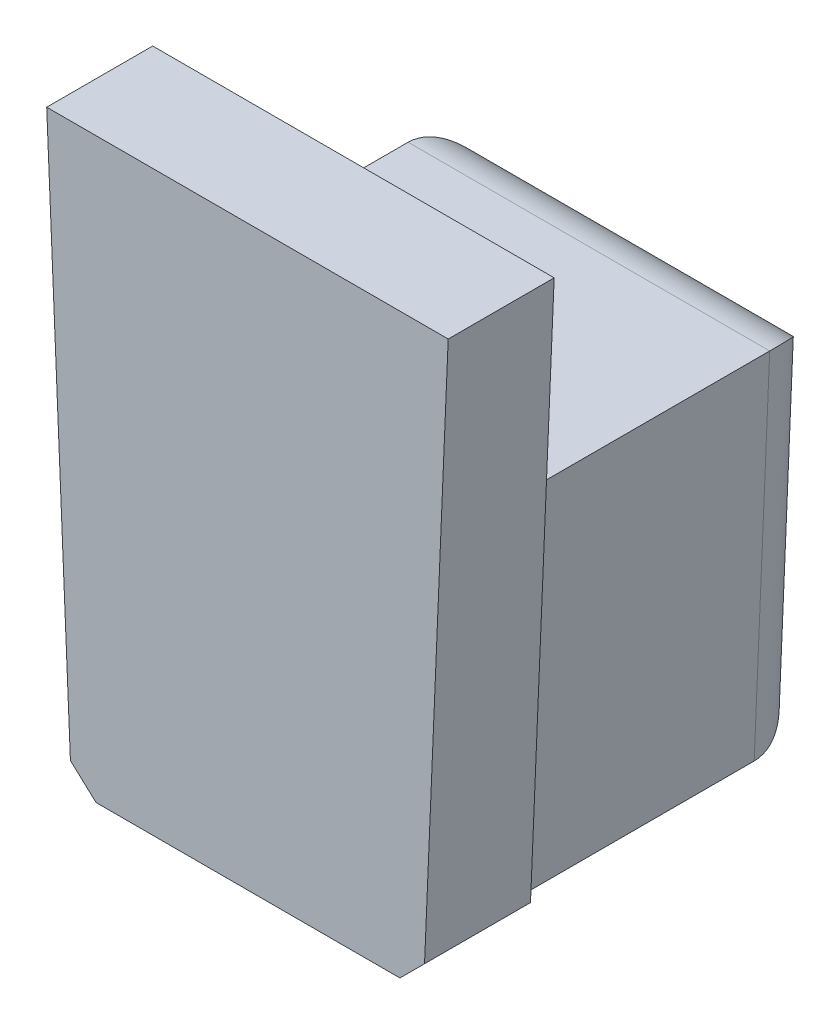
ISO-10303-21;
HEADER;
FILE_DESCRIPTION(('STEP AP214'),'2;1');
FILE_NAME('part.step','',(''),(''),'','','');
FILE_SCHEMA(('AUTOMOTIVE_DESIGN { 1 0 10303 214 1 1 1 1 }'));
ENDSEC;
DATA;
#1=APPLICATION_CONTEXT('core data for automotive mechanical design processes');
#2=APPLICATION_PROTOCOL_DEFINITION('international standard','automotive_design',2000,#1);
#3=PRODUCT_CONTEXT('',#1,'mechanical');
#4=PRODUCT('Part','Part','',(#3));
#5=PRODUCT_RELATED_PRODUCT_CATEGORY('part','',(#4));
#6=PRODUCT_DEFINITION_FORMATION('','',#4);
#7=PRODUCT_DEFINITION_CONTEXT('part definition',#1,'design');
#8=PRODUCT_DEFINITION('design','',#6,#7);
#9=PRODUCT_DEFINITION_SHAPE('','',#8);
#10=(LENGTH_UNIT() NAMED_UNIT(*) SI_UNIT(.MILLI.,.METRE.));
#11=(NAMED_UNIT(*) PLANE_ANGLE_UNIT() SI_UNIT($,.RADIAN.));
#12=(NAMED_UNIT(*) SI_UNIT($,.STERADIAN.) SOLID_ANGLE_UNIT());
#13=UNCERTAINTY_MEASURE_WITH_UNIT(LENGTH_MEASURE(1.E-05),#10,'distance_accuracy_value','');
#14=(GEOMETRIC_REPRESENTATION_CONTEXT(3) GLOBAL_UNCERTAINTY_ASSIGNED_CONTEXT((#13)) GLOBAL_UNIT_ASSIGNED_CONTEXT((#10,
#11,#12)) REPRESENTATION_CONTEXT('',''));
#15=CARTESIAN_POINT('',(0.,0.,0.));
#16=DIRECTION('',(0.,0.,1.));
#17=DIRECTION('',(1.,0.,0.));
#18=AXIS2_PLACEMENT_3D('',#15,#16,#17);
#19=CARTESIAN_POINT('',(0.,0.,0.));
#20=DIRECTION('',(0.,0.,-1.));
#21=DIRECTION('',(-1.,0.,0.));
#22=AXIS2_PLACEMENT_3D('',#19,#20,#21);
#23=PLANE('',#22);
#24=DIRECTION('',(0.0427742711573851,0.999084762033209,0.));
#25=VECTOR('',#24,1.);
#26=CARTESIAN_POINT('',(68.2,0.,0.));
#27=LINE('',#26,#25);
#28=CARTESIAN_POINT('',(64.1789137380191,-93.9210862619809,0.));
#29=VERTEX_POINT('',#28);
#30=CARTESIAN_POINT('',(68.2,0.,0.));
#31=VERTEX_POINT('',#30);
#32=EDGE_CURVE('E167',#29,#31,#27,.T.);
#33=ORIENTED_EDGE('',*,*,#32,.F.);
#34=DIRECTION('',(0.70710678118655,0.707106781186545,0.));
#35=VECTOR('',#34,1.);
#36=CARTESIAN_POINT('',(79.0499999999997,-79.0500000000004,0.));
#37=LINE('',#36,#35);
#38=CARTESIAN_POINT('',(60.,-98.1,0.));
#39=VERTEX_POINT('',#38);
#40=EDGE_CURVE('E180',#29,#39,#37,.F.);
#41=ORIENTED_EDGE('',*,*,#40,.T.);
#42=DIRECTION('',(1.,0.,0.));
#43=VECTOR('',#42,1.);
#44=CARTESIAN_POINT('',(64.,-98.1,0.));
#45=LINE('',#44,#43);
#46=CARTESIAN_POINT('',(8.38274194225,-98.1,0.));
#47=VERTEX_POINT('',#46);
#48=EDGE_CURVE('E164',#47,#39,#45,.T.);
#49=ORIENTED_EDGE('',*,*,#48,.F.);
#50=DIRECTION('',(0.736705587409529,-0.676213633018133,0.));
#51=VECTOR('',#50,1.);
#52=CARTESIAN_POINT('',(-45.0373790182484,-49.0662819336187,0.));
#53=LINE('',#52,#51);
#54=CARTESIAN_POINT('',(4.02890291537046,-94.1036609518671,0.));
#55=VERTEX_POINT('',#54);
#56=EDGE_CURVE('E178',#47,#55,#53,.F.);
#57=ORIENTED_EDGE('',*,*,#56,.T.);
#58=DIRECTION('',(0.0427742711573851,-0.999084762033209,0.));
#59=VECTOR('',#58,1.);
#60=CARTESIAN_POINT('',(4.2,-98.1,0.));
#61=LINE('',#60,#59);
#62=CARTESIAN_POINT('',(0.,0.,0.));
#63=VERTEX_POINT('',#62);
#64=EDGE_CURVE('E127',#63,#55,#61,.T.);
#65=ORIENTED_EDGE('',*,*,#64,.F.);
#66=DIRECTION('',(-1.,0.,0.));
#67=VECTOR('',#66,1.);
#68=CARTESIAN_POINT('',(0.,0.,0.));
#69=LINE('',#68,#67);
#70=EDGE_CURVE('E154',#31,#63,#69,.T.);
#71=ORIENTED_EDGE('',*,*,#70,.F.);
#72=EDGE_LOOP('',(#33,#41,#49,#57,#65,#71));
#73=FACE_BOUND('',#72,.T.);
#74=DIRECTION('',(-1.,0.,0.));
#75=VECTOR('',#74,1.);
#76=CARTESIAN_POINT('',(62.1694216698406,-94.1,0.));
#77=LINE('',#76,#75);
#78=CARTESIAN_POINT('',(62.1694216698406,-94.1,0.));
#79=VERTEX_POINT('',#78);
#80=CARTESIAN_POINT('',(6.0305783301594,-94.1,0.));
#81=VERTEX_POINT('',#80);
#82=EDGE_CURVE('E123',#79,#81,#77,.T.);
#83=ORIENTED_EDGE('',*,*,#82,.F.);
#84=DIRECTION('',(-0.0427742711573849,-0.999084762033209,0.));
#85=VECTOR('',#84,1.);
#86=CARTESIAN_POINT('',(64.8086098923266,-32.4561036605051,0.));
#87=LINE('',#86,#85);
#88=CARTESIAN_POINT('',(64.8086098923266,-32.4561036605051,0.));
#89=VERTEX_POINT('',#88);
#90=EDGE_CURVE('E131',#89,#79,#87,.T.);
#91=ORIENTED_EDGE('',*,*,#90,.F.);
#92=DIRECTION('',(1.,0.,0.));
#93=VECTOR('',#92,1.);
#94=CARTESIAN_POINT('',(3.39139010767338,-32.4561036605051,0.));
#95=LINE('',#94,#93);
#96=CARTESIAN_POINT('',(3.39139010767338,-32.4561036605051,0.));
#97=VERTEX_POINT('',#96);
#98=EDGE_CURVE('E142',#97,#89,#95,.T.);
#99=ORIENTED_EDGE('',*,*,#98,.F.);
#100=DIRECTION('',(-0.0427742711573851,0.999084762033209,0.));
#101=VECTOR('',#100,1.);
#102=CARTESIAN_POINT('',(6.0305783301594,-94.1,0.));
#103=LINE('',#102,#101);
#104=EDGE_CURVE('E140',#81,#97,#103,.T.);
#105=ORIENTED_EDGE('',*,*,#104,.F.);
#106=EDGE_LOOP('',(#83,#91,#99,#105));
#107=FACE_BOUND('',#106,.T.);
#108=ADVANCED_FACE('F32',(#73,#107),#23,.T.);
#109=CARTESIAN_POINT('',(4.2,-98.1,18.));
#110=DIRECTION('',(0.999084762033209,0.0427742711573851,0.));
#111=DIRECTION('',(-0.0427742711573851,0.99908476203321,0.));
#112=AXIS2_PLACEMENT_3D('',#109,#110,#111);
#113=PLANE('',#112);
#114=ORIENTED_EDGE('',*,*,#64,.T.);
#115=DIRECTION('',(0.,0.,1.));
#116=VECTOR('',#115,1.);
#117=CARTESIAN_POINT('',(4.02890291537046,-94.1036609518671,18.));
#118=LINE('',#117,#116);
#119=CARTESIAN_POINT('',(4.02890291537046,-94.1036609518671,18.));
#120=VERTEX_POINT('',#119);
#121=EDGE_CURVE('E191',#55,#120,#118,.T.);
#122=ORIENTED_EDGE('',*,*,#121,.T.);
#123=DIRECTION('',(0.0427742711573851,-0.999084762033209,0.));
#124=VECTOR('',#123,1.);
#125=CARTESIAN_POINT('',(4.2,-98.1,18.));
#126=LINE('',#125,#124);
#127=CARTESIAN_POINT('',(0.,0.,18.));
#128=VERTEX_POINT('',#127);
#129=EDGE_CURVE('E150',#128,#120,#126,.T.);
#130=ORIENTED_EDGE('',*,*,#129,.F.);
#131=DIRECTION('',(0.,0.,-1.));
#132=VECTOR('',#131,1.);
#133=CARTESIAN_POINT('',(0.,0.,18.));
#134=LINE('',#133,#132);
#135=EDGE_CURVE('E161',#128,#63,#134,.T.);
#136=ORIENTED_EDGE('',*,*,#135,.T.);
#137=EDGE_LOOP('',(#114,#122,#130,#136));
#138=FACE_BOUND('',#137,.T.);
#139=ADVANCED_FACE('F247',(#138),#113,.F.);
#140=CARTESIAN_POINT('',(64.,-98.1,18.));
#141=DIRECTION('',(0.,1.,0.));
#142=DIRECTION('',(0.,0.,1.));
#143=AXIS2_PLACEMENT_3D('',#140,#141,#142);
#144=PLANE('',#143);
#145=ORIENTED_EDGE('',*,*,#48,.T.);
#146=DIRECTION('',(0.,0.,1.));
#147=VECTOR('',#146,1.);
#148=CARTESIAN_POINT('',(60.,-98.1,18.));
#149=LINE('',#148,#147);
#150=CARTESIAN_POINT('',(60.,-98.1,18.));
#151=VERTEX_POINT('',#150);
#152=EDGE_CURVE('E185',#39,#151,#149,.T.);
#153=ORIENTED_EDGE('',*,*,#152,.T.);
#154=DIRECTION('',(1.,0.,0.));
#155=VECTOR('',#154,1.);
#156=CARTESIAN_POINT('',(64.,-98.1,18.));
#157=LINE('',#156,#155);
#158=CARTESIAN_POINT('',(8.38274194225002,-98.1,18.));
#159=VERTEX_POINT('',#158);
#160=EDGE_CURVE('E153',#159,#151,#157,.T.);
#161=ORIENTED_EDGE('',*,*,#160,.F.);
#162=DIRECTION('',(0.,0.,-1.));
#163=VECTOR('',#162,1.);
#164=CARTESIAN_POINT('',(8.38274194225001,-98.1,18.));
#165=LINE('',#164,#163);
#166=EDGE_CURVE('E182',#159,#47,#165,.T.);
#167=ORIENTED_EDGE('',*,*,#166,.T.);
#168=EDGE_LOOP('',(#145,#153,#161,#167));
#169=FACE_BOUND('',#168,.T.);
#170=ADVANCED_FACE('F253',(#169),#144,.F.);
#171=CARTESIAN_POINT('',(68.2,0.,18.));
#172=DIRECTION('',(-0.999084762033209,0.0427742711573851,0.));
#173=DIRECTION('',(-0.0427742711573851,-0.99908476203321,0.));
#174=AXIS2_PLACEMENT_3D('',#171,#172,#173);
#175=PLANE('',#174);
#176=DIRECTION('',(0.0427742711573851,0.999084762033209,0.));
#177=VECTOR('',#176,1.);
#178=CARTESIAN_POINT('',(68.2,0.,18.));
#179=LINE('',#178,#177);
#180=CARTESIAN_POINT('',(64.1789137380192,-93.9210862619808,18.));
#181=VERTEX_POINT('',#180);
#182=CARTESIAN_POINT('',(68.2,0.,18.));
#183=VERTEX_POINT('',#182);
#184=EDGE_CURVE('E157',#181,#183,#179,.T.);
#185=ORIENTED_EDGE('',*,*,#184,.F.);
#186=DIRECTION('',(0.,0.,-1.));
#187=VECTOR('',#186,1.);
#188=CARTESIAN_POINT('',(64.1789137380192,-93.9210862619808,18.));
#189=LINE('',#188,#187);
#190=EDGE_CURVE('E175',#181,#29,#189,.T.);
#191=ORIENTED_EDGE('',*,*,#190,.T.);
#192=ORIENTED_EDGE('',*,*,#32,.T.);
#193=DIRECTION('',(0.,0.,-1.));
#194=VECTOR('',#193,1.);
#195=CARTESIAN_POINT('',(68.2,0.,18.));
#196=LINE('',#195,#194);
#197=EDGE_CURVE('E172',#183,#31,#196,.T.);
#198=ORIENTED_EDGE('',*,*,#197,.F.);
#199=EDGE_LOOP('',(#185,#191,#192,#198));
#200=FACE_BOUND('',#199,.T.);
#201=ADVANCED_FACE('F264',(#200),#175,.F.);
#202=CARTESIAN_POINT('',(0.,0.,18.));
#203=DIRECTION('',(0.,-1.,0.));
#204=DIRECTION('',(0.,0.,-1.));
#205=AXIS2_PLACEMENT_3D('',#202,#203,#204);
#206=PLANE('',#205);
#207=ORIENTED_EDGE('',*,*,#70,.T.);
#208=ORIENTED_EDGE('',*,*,#135,.F.);
#209=DIRECTION('',(-1.,0.,0.));
#210=VECTOR('',#209,1.);
#211=CARTESIAN_POINT('',(0.,0.,18.));
#212=LINE('',#211,#210);
#213=EDGE_CURVE('E159',#183,#128,#212,.T.);
#214=ORIENTED_EDGE('',*,*,#213,.F.);
#215=ORIENTED_EDGE('',*,*,#197,.T.);
#216=EDGE_LOOP('',(#207,#208,#214,#215));
#217=FACE_BOUND('',#216,.T.);
#218=ADVANCED_FACE('F261',(#217),#206,.F.);
#219=CARTESIAN_POINT('',(0.,0.,18.));
#220=DIRECTION('',(0.,0.,-1.));
#221=DIRECTION('',(-1.,0.,0.));
#222=AXIS2_PLACEMENT_3D('',#219,#220,#221);
#223=PLANE('',#222);
#224=ORIENTED_EDGE('',*,*,#160,.T.);
#225=DIRECTION('',(-0.70710678118655,-0.707106781186545,0.));
#226=VECTOR('',#225,1.);
#227=CARTESIAN_POINT('',(64.1789137380192,-93.9210862619808,18.));
#228=LINE('',#227,#226);
#229=EDGE_CURVE('E189',#151,#181,#228,.F.);
#230=ORIENTED_EDGE('',*,*,#229,.T.);
#231=ORIENTED_EDGE('',*,*,#184,.T.);
#232=ORIENTED_EDGE('',*,*,#213,.T.);
#233=ORIENTED_EDGE('',*,*,#129,.T.);
#234=DIRECTION('',(-0.736705587409529,0.676213633018133,0.));
#235=VECTOR('',#234,1.);
#236=CARTESIAN_POINT('',(8.38274194225001,-98.1,18.));
#237=LINE('',#236,#235);
#238=EDGE_CURVE('E187',#120,#159,#237,.F.);
#239=ORIENTED_EDGE('',*,*,#238,.T.);
#240=EDGE_LOOP('',(#224,#230,#231,#232,#233,#239));
#241=FACE_BOUND('',#240,.T.);
#242=ADVANCED_FACE('F259',(#241),#223,.F.);
#243=CARTESIAN_POINT('',(64.8086098923266,-32.4561036605051,-50.));
#244=DIRECTION('',(-0.999084762033209,0.0427742711573849,0.));
#245=DIRECTION('',(-0.0427742711573849,-0.999084762033209,0.));
#246=AXIS2_PLACEMENT_3D('',#243,#244,#245);
#247=PLANE('',#246);
#248=DIRECTION('',(0.,0.,1.));
#249=VECTOR('',#248,1.);
#250=CARTESIAN_POINT('',(62.1694216698406,-94.1,-50.));
#251=LINE('',#250,#249);
#252=CARTESIAN_POINT('',(62.1694216698406,-94.1,-40.));
#253=VERTEX_POINT('',#252);
#254=EDGE_CURVE('E119',#253,#79,#251,.T.);
#255=ORIENTED_EDGE('',*,*,#254,.F.);
#256=DIRECTION('',(-0.0427742711573849,-0.999084762033209,0.));
#257=VECTOR('',#256,1.);
#258=CARTESIAN_POINT('',(64.8086098923266,-32.4561036605051,-40.));
#259=LINE('',#258,#257);
#260=CARTESIAN_POINT('',(64.8086098923266,-32.4561036605051,-40.));
#261=VERTEX_POINT('',#260);
#262=EDGE_CURVE('E205',#253,#261,#259,.F.);
#263=ORIENTED_EDGE('',*,*,#262,.T.);
#264=DIRECTION('',(0.,0.,1.));
#265=VECTOR('',#264,1.);
#266=CARTESIAN_POINT('',(64.8086098923266,-32.4561036605051,-50.));
#267=LINE('',#266,#265);
#268=EDGE_CURVE('E134',#261,#89,#267,.T.);
#269=ORIENTED_EDGE('',*,*,#268,.T.);
#270=ORIENTED_EDGE('',*,*,#90,.T.);
#271=EDGE_LOOP('',(#255,#263,#269,#270));
#272=FACE_BOUND('',#271,.T.);
#273=ADVANCED_FACE('F132',(#272),#247,.F.);
#274=CARTESIAN_POINT('',(62.1694216698406,-94.1,-50.));
#275=DIRECTION('',(0.,1.,0.));
#276=DIRECTION('',(-1.,0.,0.));
#277=AXIS2_PLACEMENT_3D('',#274,#275,#276);
#278=PLANE('',#277);
#279=DIRECTION('',(0.,0.,1.));
#280=VECTOR('',#279,1.);
#281=CARTESIAN_POINT('',(6.0305783301594,-94.1,-50.));
#282=LINE('',#281,#280);
#283=CARTESIAN_POINT('',(6.0305783301594,-94.1,-40.));
#284=VERTEX_POINT('',#283);
#285=EDGE_CURVE('E128',#284,#81,#282,.T.);
#286=ORIENTED_EDGE('',*,*,#285,.F.);
#287=DIRECTION('',(-1.,0.,0.));
#288=VECTOR('',#287,1.);
#289=CARTESIAN_POINT('',(62.1694216698406,-94.1,-40.));
#290=LINE('',#289,#288);
#291=EDGE_CURVE('E11',#284,#253,#290,.F.);
#292=ORIENTED_EDGE('',*,*,#291,.T.);
#293=ORIENTED_EDGE('',*,*,#254,.T.);
#294=ORIENTED_EDGE('',*,*,#82,.T.);
#295=EDGE_LOOP('',(#286,#292,#293,#294));
#296=FACE_BOUND('',#295,.T.);
#297=ADVANCED_FACE('F121',(#296),#278,.F.);
#298=CARTESIAN_POINT('',(6.0305783301594,-94.1,-50.));
#299=DIRECTION('',(0.999084762033209,0.0427742711573851,0.));
#300=DIRECTION('',(-0.0427742711573851,0.999084762033209,0.));
#301=AXIS2_PLACEMENT_3D('',#298,#299,#300);
#302=PLANE('',#301);
#303=DIRECTION('',(0.,0.,1.));
#304=VECTOR('',#303,1.);
#305=CARTESIAN_POINT('',(3.39139010767338,-32.4561036605051,-50.));
#306=LINE('',#305,#304);
#307=CARTESIAN_POINT('',(3.39139010767338,-32.4561036605051,-40.));
#308=VERTEX_POINT('',#307);
#309=EDGE_CURVE('E147',#308,#97,#306,.T.);
#310=ORIENTED_EDGE('',*,*,#309,.F.);
#311=DIRECTION('',(-0.0427742711573851,0.999084762033209,0.));
#312=VECTOR('',#311,1.);
#313=CARTESIAN_POINT('',(6.0305783301594,-94.1,-40.));
#314=LINE('',#313,#312);
#315=EDGE_CURVE('E41',#308,#284,#314,.F.);
#316=ORIENTED_EDGE('',*,*,#315,.T.);
#317=ORIENTED_EDGE('',*,*,#285,.T.);
#318=ORIENTED_EDGE('',*,*,#104,.T.);
#319=EDGE_LOOP('',(#310,#316,#317,#318));
#320=FACE_BOUND('',#319,.T.);
#321=ADVANCED_FACE('F244',(#320),#302,.F.);
#322=CARTESIAN_POINT('',(3.39139010767338,-32.4561036605051,-50.));
#323=DIRECTION('',(0.,-1.,0.));
#324=DIRECTION('',(1.,0.,0.));
#325=AXIS2_PLACEMENT_3D('',#322,#323,#324);
#326=PLANE('',#325);
#327=ORIENTED_EDGE('',*,*,#268,.F.);
#328=DIRECTION('',(1.,0.,0.));
#329=VECTOR('',#328,1.);
#330=CARTESIAN_POINT('',(3.39139010767338,-32.4561036605051,-40.));
#331=LINE('',#330,#329);
#332=EDGE_CURVE('E202',#261,#308,#331,.F.);
#333=ORIENTED_EDGE('',*,*,#332,.T.);
#334=ORIENTED_EDGE('',*,*,#309,.T.);
#335=ORIENTED_EDGE('',*,*,#98,.T.);
#336=EDGE_LOOP('',(#327,#333,#334,#335));
#337=FACE_BOUND('',#336,.T.);
#338=ADVANCED_FACE('F228',(#337),#326,.F.);
#339=CARTESIAN_POINT('',(0.,0.,-50.));
#340=DIRECTION('',(0.,0.,-1.));
#341=DIRECTION('',(-1.,0.,0.));
#342=AXIS2_PLACEMENT_3D('',#339,#340,#341);
#343=PLANE('',#342);
#344=DIRECTION('',(-0.0427742711573851,0.999084762033209,0.));
#345=VECTOR('',#344,1.);
#346=CARTESIAN_POINT('',(13.3822377280055,-32.0283609489312,-50.));
#347=LINE('',#346,#345);
#348=CARTESIAN_POINT('',(15.6116045375314,-84.1,-50.));
#349=VERTEX_POINT('',#348);
#350=CARTESIAN_POINT('',(13.8286854281952,-42.4561036605051,-50.));
#351=VERTEX_POINT('',#350);
#352=EDGE_CURVE('E195',#349,#351,#347,.T.);
#353=ORIENTED_EDGE('',*,*,#352,.T.);
#354=DIRECTION('',(1.,0.,0.));
#355=VECTOR('',#354,1.);
#356=CARTESIAN_POINT('',(64.8086098923266,-42.4561036605051,-50.));
#357=LINE('',#356,#355);
#358=CARTESIAN_POINT('',(54.3713145718048,-42.4561036605051,-50.));
#359=VERTEX_POINT('',#358);
#360=EDGE_CURVE('E199',#351,#359,#357,.T.);
#361=ORIENTED_EDGE('',*,*,#360,.T.);
#362=DIRECTION('',(-0.0427742711573849,-0.999084762033209,0.));
#363=VECTOR('',#362,1.);
#364=CARTESIAN_POINT('',(52.1785740495085,-93.6722572884262,-50.));
#365=LINE('',#364,#363);
#366=CARTESIAN_POINT('',(52.5883954624686,-84.1,-50.));
#367=VERTEX_POINT('',#366);
#368=EDGE_CURVE('E197',#359,#367,#365,.T.);
#369=ORIENTED_EDGE('',*,*,#368,.T.);
#370=DIRECTION('',(-1.,0.,0.));
#371=VECTOR('',#370,1.);
#372=CARTESIAN_POINT('',(6.03057833015941,-84.1,-50.));
#373=LINE('',#372,#371);
#374=EDGE_CURVE('E193',#367,#349,#373,.T.);
#375=ORIENTED_EDGE('',*,*,#374,.T.);
#376=EDGE_LOOP('',(#353,#361,#369,#375));
#377=FACE_BOUND('',#376,.T.);
#378=ADVANCED_FACE('F233',(#377),#343,.T.);
#379=CARTESIAN_POINT('',(64.1789137380192,-93.9210862619808,18.));
#380=DIRECTION('',(-0.707106781186545,0.707106781186551,0.));
#381=DIRECTION('',(0.,0.,-1.));
#382=AXIS2_PLACEMENT_3D('',#379,#380,#381);
#383=PLANE('',#382);
#384=ORIENTED_EDGE('',*,*,#229,.F.);
#385=ORIENTED_EDGE('',*,*,#152,.F.);
#386=ORIENTED_EDGE('',*,*,#40,.F.);
#387=ORIENTED_EDGE('',*,*,#190,.F.);
#388=EDGE_LOOP('',(#384,#385,#386,#387));
#389=FACE_BOUND('',#388,.T.);
#390=ADVANCED_FACE('F235',(#389),#383,.F.);
#391=CARTESIAN_POINT('',(8.38274194225001,-98.1,18.));
#392=DIRECTION('',(0.676213633018133,0.736705587409529,0.));
#393=DIRECTION('',(0.,0.,-1.));
#394=AXIS2_PLACEMENT_3D('',#391,#392,#393);
#395=PLANE('',#394);
#396=ORIENTED_EDGE('',*,*,#238,.F.);
#397=ORIENTED_EDGE('',*,*,#121,.F.);
#398=ORIENTED_EDGE('',*,*,#56,.F.);
#399=ORIENTED_EDGE('',*,*,#166,.F.);
#400=EDGE_LOOP('',(#396,#397,#398,#399));
#401=FACE_BOUND('',#400,.T.);
#402=ADVANCED_FACE('F241',(#401),#395,.F.);
#403=CARTESIAN_POINT('',(0.,-84.1,-40.));
#404=DIRECTION('',(1.,0.,0.));
#405=DIRECTION('',(0.,1.,0.));
#406=AXIS2_PLACEMENT_3D('',#403,#404,#405);
#407=CYLINDRICAL_SURFACE('',#406,10.);
#408=CARTESIAN_POINT('',(52.5883954624686,-84.1,-40.));
#409=DIRECTION('',(0.722071419998529,0.691818519860019,0.));
#410=DIRECTION('',(0.691818519860019,-0.722071419998529,0.));
#411=AXIS2_PLACEMENT_3D('',#408,#409,#410);
#412=ELLIPSE('',#411,13.8490455695094,10.);
#413=EDGE_CURVE('E211',#253,#367,#412,.T.);
#414=ORIENTED_EDGE('',*,*,#413,.F.);
#415=ORIENTED_EDGE('',*,*,#291,.F.);
#416=CARTESIAN_POINT('',(15.6116045375314,-84.1,-40.));
#417=DIRECTION('',(0.722071419998529,-0.691818519860019,0.));
#418=DIRECTION('',(0.691818519860019,0.722071419998529,0.));
#419=AXIS2_PLACEMENT_3D('',#416,#417,#418);
#420=ELLIPSE('',#419,13.8490455695094,10.);
#421=EDGE_CURVE('E36',#349,#284,#420,.F.);
#422=ORIENTED_EDGE('',*,*,#421,.F.);
#423=ORIENTED_EDGE('',*,*,#374,.F.);
#424=EDGE_LOOP('',(#414,#415,#422,#423));
#425=FACE_BOUND('',#424,.T.);
#426=ADVANCED_FACE('F34',(#425),#407,.T.);
#427=CARTESIAN_POINT('',(11.9890171443985,0.513291253888621,-40.));
#428=DIRECTION('',(0.0427742711573851,-0.999084762033209,0.));
#429=DIRECTION('',(0.999084762033209,0.0427742711573851,0.));
#430=AXIS2_PLACEMENT_3D('',#427,#428,#429);
#431=CYLINDRICAL_SURFACE('',#430,10.);
#432=ORIENTED_EDGE('',*,*,#421,.T.);
#433=ORIENTED_EDGE('',*,*,#315,.F.);
#434=CARTESIAN_POINT('',(13.8286854281952,-42.4561036605051,-40.));
#435=DIRECTION('',(-0.691818519860019,-0.722071419998529,0.));
#436=DIRECTION('',(0.722071419998529,-0.691818519860019,0.));
#437=AXIS2_PLACEMENT_3D('',#434,#435,#436);
#438=ELLIPSE('',#437,14.4546578516334,10.);
#439=EDGE_CURVE('E210',#351,#308,#438,.F.);
#440=ORIENTED_EDGE('',*,*,#439,.F.);
#441=ORIENTED_EDGE('',*,*,#352,.F.);
#442=EDGE_LOOP('',(#432,#433,#440,#441));
#443=FACE_BOUND('',#442,.T.);
#444=ADVANCED_FACE('F220',(#443),#431,.T.);
#445=CARTESIAN_POINT('',(56.0862015253798,-2.40124410200402,-40.));
#446=DIRECTION('',(0.0427742711573849,0.999084762033209,0.));
#447=DIRECTION('',(-0.999084762033209,0.0427742711573849,0.));
#448=AXIS2_PLACEMENT_3D('',#445,#446,#447);
#449=CYLINDRICAL_SURFACE('',#448,10.);
#450=ORIENTED_EDGE('',*,*,#413,.T.);
#451=ORIENTED_EDGE('',*,*,#368,.F.);
#452=CARTESIAN_POINT('',(54.3713145718048,-42.4561036605051,-40.));
#453=DIRECTION('',(-0.691818519860019,0.722071419998529,0.));
#454=DIRECTION('',(0.722071419998529,0.691818519860019,0.));
#455=AXIS2_PLACEMENT_3D('',#452,#453,#454);
#456=ELLIPSE('',#455,14.4546578516334,10.);
#457=EDGE_CURVE('E208',#261,#359,#456,.T.);
#458=ORIENTED_EDGE('',*,*,#457,.F.);
#459=ORIENTED_EDGE('',*,*,#262,.F.);
#460=EDGE_LOOP('',(#450,#451,#458,#459));
#461=FACE_BOUND('',#460,.T.);
#462=ADVANCED_FACE('F225',(#461),#449,.T.);
#463=CARTESIAN_POINT('',(0.,-42.4561036605051,-40.));
#464=DIRECTION('',(-1.,0.,0.));
#465=DIRECTION('',(0.,-1.,0.));
#466=AXIS2_PLACEMENT_3D('',#463,#464,#465);
#467=CYLINDRICAL_SURFACE('',#466,10.);
#468=ORIENTED_EDGE('',*,*,#439,.T.);
#469=ORIENTED_EDGE('',*,*,#332,.F.);
#470=ORIENTED_EDGE('',*,*,#457,.T.);
#471=ORIENTED_EDGE('',*,*,#360,.F.);
#472=EDGE_LOOP('',(#468,#469,#470,#471));
#473=FACE_BOUND('',#472,.T.);
#474=ADVANCED_FACE('F230',(#473),#467,.T.);
#475=CLOSED_SHELL('',(#108,#139,#170,#201,#218,#242,#273,#297,#321,#338,#378,#390,#402,#426,
#444,#462,#474));
#476=MANIFOLD_SOLID_BREP('B2',#475);
#477=ADVANCED_BREP_SHAPE_REPRESENTATION('',(#18,#476),#14);
#478=SHAPE_DEFINITION_REPRESENTATION(#9,#477);
ENDSEC;
END-ISO-10303-21;
